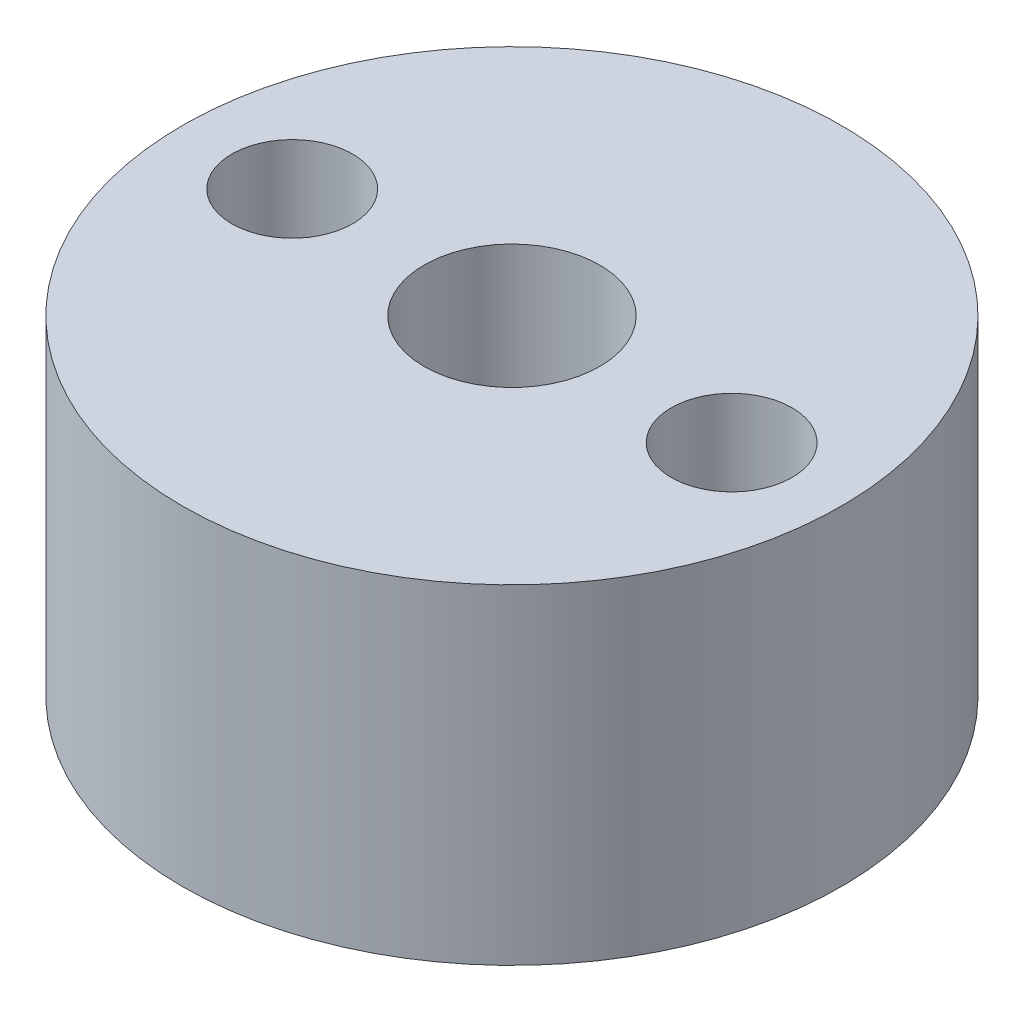
ISO-10303-21;
HEADER;
FILE_DESCRIPTION(('STEP AP214'),'2;1');
FILE_NAME('part.step','',(''),(''),'','','');
FILE_SCHEMA(('AUTOMOTIVE_DESIGN { 1 0 10303 214 1 1 1 1 }'));
ENDSEC;
DATA;
#1=APPLICATION_CONTEXT('core data for automotive mechanical design processes');
#2=APPLICATION_PROTOCOL_DEFINITION('international standard','automotive_design',2000,#1);
#3=PRODUCT_CONTEXT('',#1,'mechanical');
#4=PRODUCT('Part','Part','',(#3));
#5=PRODUCT_RELATED_PRODUCT_CATEGORY('part','',(#4));
#6=PRODUCT_DEFINITION_FORMATION('','',#4);
#7=PRODUCT_DEFINITION_CONTEXT('part definition',#1,'design');
#8=PRODUCT_DEFINITION('design','',#6,#7);
#9=PRODUCT_DEFINITION_SHAPE('','',#8);
#10=(LENGTH_UNIT() NAMED_UNIT(*) SI_UNIT(.MILLI.,.METRE.));
#11=(NAMED_UNIT(*) PLANE_ANGLE_UNIT() SI_UNIT($,.RADIAN.));
#12=(NAMED_UNIT(*) SI_UNIT($,.STERADIAN.) SOLID_ANGLE_UNIT());
#13=UNCERTAINTY_MEASURE_WITH_UNIT(LENGTH_MEASURE(1.E-05),#10,'distance_accuracy_value','');
#14=(GEOMETRIC_REPRESENTATION_CONTEXT(3) GLOBAL_UNCERTAINTY_ASSIGNED_CONTEXT((#13)) GLOBAL_UNIT_ASSIGNED_CONTEXT((#10,
#11,#12)) REPRESENTATION_CONTEXT('',''));
#15=CARTESIAN_POINT('',(0.,0.,0.));
#16=DIRECTION('',(0.,0.,1.));
#17=DIRECTION('',(1.,0.,0.));
#18=AXIS2_PLACEMENT_3D('',#15,#16,#17);
#19=CARTESIAN_POINT('',(0.,15.,0.));
#20=DIRECTION('',(0.,1.,0.));
#21=DIRECTION('',(0.,0.,1.));
#22=AXIS2_PLACEMENT_3D('',#19,#20,#21);
#23=PLANE('',#22);
#24=CARTESIAN_POINT('',(-10.,15.,0.));
#25=DIRECTION('',(0.,1.,0.));
#26=DIRECTION('',(0.,0.,1.));
#27=AXIS2_PLACEMENT_3D('',#24,#25,#26);
#28=CIRCLE('',#27,2.75);
#29=CARTESIAN_POINT('',(-10.,15.,2.75));
#30=VERTEX_POINT('',#29);
#31=EDGE_CURVE('E46',#30,#30,#28,.T.);
#32=ORIENTED_EDGE('',*,*,#31,.F.);
#33=EDGE_LOOP('',(#32));
#34=FACE_BOUND('',#33,.T.);
#35=CARTESIAN_POINT('',(0.,15.,0.));
#36=DIRECTION('',(0.,1.,0.));
#37=DIRECTION('',(0.,0.,1.));
#38=AXIS2_PLACEMENT_3D('',#35,#36,#37);
#39=CIRCLE('',#38,15.);
#40=CARTESIAN_POINT('',(0.,15.,15.));
#41=VERTEX_POINT('',#40);
#42=EDGE_CURVE('E10',#41,#41,#39,.T.);
#43=ORIENTED_EDGE('',*,*,#42,.T.);
#44=EDGE_LOOP('',(#43));
#45=FACE_BOUND('',#44,.T.);
#46=CARTESIAN_POINT('',(0.,15.,0.));
#47=DIRECTION('',(0.,1.,0.));
#48=DIRECTION('',(0.,0.,1.));
#49=AXIS2_PLACEMENT_3D('',#46,#47,#48);
#50=CIRCLE('',#49,4.);
#51=CARTESIAN_POINT('',(0.,15.,4.));
#52=VERTEX_POINT('',#51);
#53=EDGE_CURVE('E41',#52,#52,#50,.T.);
#54=ORIENTED_EDGE('',*,*,#53,.F.);
#55=EDGE_LOOP('',(#54));
#56=FACE_BOUND('',#55,.T.);
#57=CARTESIAN_POINT('',(10.,15.,0.));
#58=DIRECTION('',(0.,1.,0.));
#59=DIRECTION('',(0.,0.,-1.));
#60=AXIS2_PLACEMENT_3D('',#57,#58,#59);
#61=CIRCLE('',#60,2.75);
#62=CARTESIAN_POINT('',(10.,15.,-2.75));
#63=VERTEX_POINT('',#62);
#64=EDGE_CURVE('E52',#63,#63,#61,.T.);
#65=ORIENTED_EDGE('',*,*,#64,.F.);
#66=EDGE_LOOP('',(#65));
#67=FACE_BOUND('',#66,.T.);
#68=ADVANCED_FACE('F30',(#34,#45,#56,#67),#23,.T.);
#69=CARTESIAN_POINT('',(0.,0.,0.));
#70=DIRECTION('',(0.,1.,0.));
#71=DIRECTION('',(0.,0.,1.));
#72=AXIS2_PLACEMENT_3D('',#69,#70,#71);
#73=PLANE('',#72);
#74=CARTESIAN_POINT('',(0.,0.,0.));
#75=DIRECTION('',(0.,1.,0.));
#76=DIRECTION('',(0.,0.,1.));
#77=AXIS2_PLACEMENT_3D('',#74,#75,#76);
#78=CIRCLE('',#77,15.);
#79=CARTESIAN_POINT('',(0.,0.,15.));
#80=VERTEX_POINT('',#79);
#81=EDGE_CURVE('E34',#80,#80,#78,.T.);
#82=ORIENTED_EDGE('',*,*,#81,.F.);
#83=EDGE_LOOP('',(#82));
#84=FACE_BOUND('',#83,.T.);
#85=CARTESIAN_POINT('',(0.,0.,0.));
#86=DIRECTION('',(0.,1.,0.));
#87=DIRECTION('',(0.,0.,1.));
#88=AXIS2_PLACEMENT_3D('',#85,#86,#87);
#89=CIRCLE('',#88,4.);
#90=CARTESIAN_POINT('',(0.,0.,4.));
#91=VERTEX_POINT('',#90);
#92=EDGE_CURVE('E43',#91,#91,#89,.T.);
#93=ORIENTED_EDGE('',*,*,#92,.T.);
#94=EDGE_LOOP('',(#93));
#95=FACE_BOUND('',#94,.T.);
#96=CARTESIAN_POINT('',(-10.,0.,0.));
#97=DIRECTION('',(0.,1.,0.));
#98=DIRECTION('',(0.,0.,1.));
#99=AXIS2_PLACEMENT_3D('',#96,#97,#98);
#100=CIRCLE('',#99,2.75);
#101=CARTESIAN_POINT('',(-10.,0.,2.75));
#102=VERTEX_POINT('',#101);
#103=EDGE_CURVE('E49',#102,#102,#100,.T.);
#104=ORIENTED_EDGE('',*,*,#103,.T.);
#105=EDGE_LOOP('',(#104));
#106=FACE_BOUND('',#105,.T.);
#107=CARTESIAN_POINT('',(10.,0.,0.));
#108=DIRECTION('',(0.,1.,0.));
#109=DIRECTION('',(0.,0.,-1.));
#110=AXIS2_PLACEMENT_3D('',#107,#108,#109);
#111=CIRCLE('',#110,2.75);
#112=CARTESIAN_POINT('',(10.,0.,-2.75));
#113=VERTEX_POINT('',#112);
#114=EDGE_CURVE('E55',#113,#113,#111,.T.);
#115=ORIENTED_EDGE('',*,*,#114,.T.);
#116=EDGE_LOOP('',(#115));
#117=FACE_BOUND('',#116,.T.);
#118=ADVANCED_FACE('F65',(#84,#95,#106,#117),#73,.F.);
#119=CARTESIAN_POINT('',(0.,15.,0.));
#120=DIRECTION('',(0.,-1.,0.));
#121=DIRECTION('',(0.,0.,-1.));
#122=AXIS2_PLACEMENT_3D('',#119,#120,#121);
#123=CYLINDRICAL_SURFACE('',#122,15.);
#124=ORIENTED_EDGE('',*,*,#42,.F.);
#125=EDGE_LOOP('',(#124));
#126=FACE_BOUND('',#125,.T.);
#127=ORIENTED_EDGE('',*,*,#81,.T.);
#128=EDGE_LOOP('',(#127));
#129=FACE_BOUND('',#128,.T.);
#130=ADVANCED_FACE('F32',(#126,#129),#123,.T.);
#131=CARTESIAN_POINT('',(0.,15.,0.));
#132=DIRECTION('',(0.,-1.,0.));
#133=DIRECTION('',(0.,0.,-1.));
#134=AXIS2_PLACEMENT_3D('',#131,#132,#133);
#135=CYLINDRICAL_SURFACE('',#134,4.);
#136=ORIENTED_EDGE('',*,*,#53,.T.);
#137=EDGE_LOOP('',(#136));
#138=FACE_BOUND('',#137,.T.);
#139=ORIENTED_EDGE('',*,*,#92,.F.);
#140=EDGE_LOOP('',(#139));
#141=FACE_BOUND('',#140,.T.);
#142=ADVANCED_FACE('F74',(#138,#141),#135,.F.);
#143=CARTESIAN_POINT('',(-10.,15.,0.));
#144=DIRECTION('',(0.,-1.,0.));
#145=DIRECTION('',(0.,0.,-1.));
#146=AXIS2_PLACEMENT_3D('',#143,#144,#145);
#147=CYLINDRICAL_SURFACE('',#146,2.75);
#148=ORIENTED_EDGE('',*,*,#31,.T.);
#149=EDGE_LOOP('',(#148));
#150=FACE_BOUND('',#149,.T.);
#151=ORIENTED_EDGE('',*,*,#103,.F.);
#152=EDGE_LOOP('',(#151));
#153=FACE_BOUND('',#152,.T.);
#154=ADVANCED_FACE('F77',(#150,#153),#147,.F.);
#155=CARTESIAN_POINT('',(10.,15.,0.));
#156=DIRECTION('',(0.,-1.,0.));
#157=DIRECTION('',(0.,0.,-1.));
#158=AXIS2_PLACEMENT_3D('',#155,#156,#157);
#159=CYLINDRICAL_SURFACE('',#158,2.75);
#160=ORIENTED_EDGE('',*,*,#64,.T.);
#161=EDGE_LOOP('',(#160));
#162=FACE_BOUND('',#161,.T.);
#163=ORIENTED_EDGE('',*,*,#114,.F.);
#164=EDGE_LOOP('',(#163));
#165=FACE_BOUND('',#164,.T.);
#166=ADVANCED_FACE('F61',(#162,#165),#159,.F.);
#167=CLOSED_SHELL('',(#68,#118,#130,#142,#154,#166));
#168=MANIFOLD_SOLID_BREP('B2',#167);
#169=ADVANCED_BREP_SHAPE_REPRESENTATION('',(#18,#168),#14);
#170=SHAPE_DEFINITION_REPRESENTATION(#9,#169);
ENDSEC;
END-ISO-10303-21;
